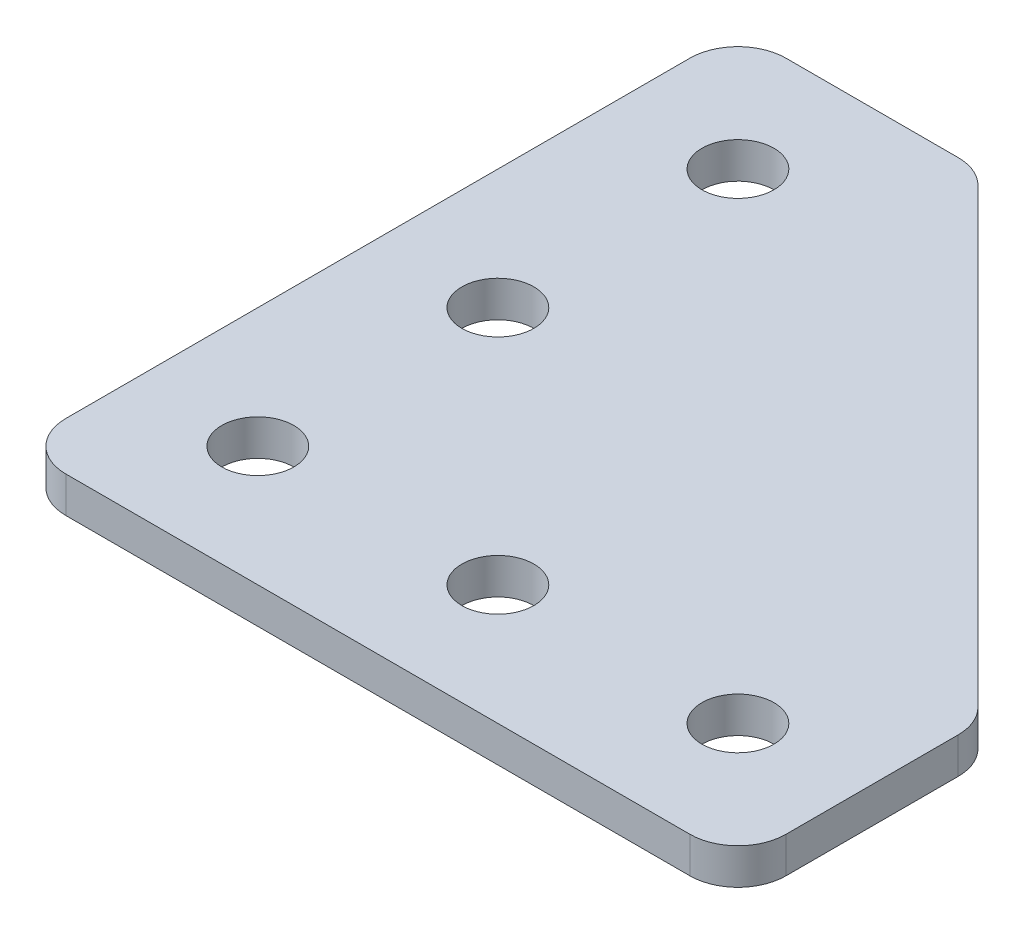
ISO-10303-21;
HEADER;
FILE_DESCRIPTION(('STEP AP214'),'2;1');
FILE_NAME('part.step','',(''),(''),'','','');
FILE_SCHEMA(('AUTOMOTIVE_DESIGN { 1 0 10303 214 1 1 1 1 }'));
ENDSEC;
DATA;
#1=APPLICATION_CONTEXT('core data for automotive mechanical design processes');
#2=APPLICATION_PROTOCOL_DEFINITION('international standard','automotive_design',2000,#1);
#3=PRODUCT_CONTEXT('',#1,'mechanical');
#4=PRODUCT('Part','Part','',(#3));
#5=PRODUCT_RELATED_PRODUCT_CATEGORY('part','',(#4));
#6=PRODUCT_DEFINITION_FORMATION('','',#4);
#7=PRODUCT_DEFINITION_CONTEXT('part definition',#1,'design');
#8=PRODUCT_DEFINITION('design','',#6,#7);
#9=PRODUCT_DEFINITION_SHAPE('','',#8);
#10=(LENGTH_UNIT() NAMED_UNIT(*) SI_UNIT(.MILLI.,.METRE.));
#11=(NAMED_UNIT(*) PLANE_ANGLE_UNIT() SI_UNIT($,.RADIAN.));
#12=(NAMED_UNIT(*) SI_UNIT($,.STERADIAN.) SOLID_ANGLE_UNIT());
#13=UNCERTAINTY_MEASURE_WITH_UNIT(LENGTH_MEASURE(1.E-05),#10,'distance_accuracy_value','');
#14=(GEOMETRIC_REPRESENTATION_CONTEXT(3) GLOBAL_UNCERTAINTY_ASSIGNED_CONTEXT((#13)) GLOBAL_UNIT_ASSIGNED_CONTEXT((#10,
#11,#12)) REPRESENTATION_CONTEXT('',''));
#15=CARTESIAN_POINT('',(0.,0.,0.));
#16=DIRECTION('',(0.,0.,1.));
#17=DIRECTION('',(1.,0.,0.));
#18=AXIS2_PLACEMENT_3D('',#15,#16,#17);
#19=CARTESIAN_POINT('',(0.,1.5,0.));
#20=DIRECTION('',(0.,1.,0.));
#21=DIRECTION('',(0.,0.,1.));
#22=AXIS2_PLACEMENT_3D('',#19,#20,#21);
#23=PLANE('',#22);
#24=CARTESIAN_POINT('',(15.,1.5,-5.));
#25=DIRECTION('',(0.,1.,0.));
#26=DIRECTION('',(0.,0.,1.));
#27=AXIS2_PLACEMENT_3D('',#24,#25,#26);
#28=CIRCLE('',#27,1.5);
#29=CARTESIAN_POINT('',(15.,1.5,-3.5));
#30=VERTEX_POINT('',#29);
#31=EDGE_CURVE('E222',#30,#30,#28,.T.);
#32=ORIENTED_EDGE('',*,*,#31,.F.);
#33=EDGE_LOOP('',(#32));
#34=FACE_BOUND('',#33,.T.);
#35=CARTESIAN_POINT('',(25.,1.5,-5.));
#36=DIRECTION('',(0.,1.,0.));
#37=DIRECTION('',(0.,0.,1.));
#38=AXIS2_PLACEMENT_3D('',#35,#36,#37);
#39=CIRCLE('',#38,1.5);
#40=CARTESIAN_POINT('',(25.,1.5,-3.5));
#41=VERTEX_POINT('',#40);
#42=EDGE_CURVE('E210',#41,#41,#39,.T.);
#43=ORIENTED_EDGE('',*,*,#42,.F.);
#44=EDGE_LOOP('',(#43));
#45=FACE_BOUND('',#44,.T.);
#46=DIRECTION('',(0.,0.,1.));
#47=VECTOR('',#46,1.);
#48=CARTESIAN_POINT('',(0.,1.5,-30.));
#49=LINE('',#48,#47);
#50=CARTESIAN_POINT('',(0.,1.5,-28.));
#51=VERTEX_POINT('',#50);
#52=CARTESIAN_POINT('',(0.,1.5,-2.00000000000001));
#53=VERTEX_POINT('',#52);
#54=EDGE_CURVE('E154',#51,#53,#49,.T.);
#55=ORIENTED_EDGE('',*,*,#54,.T.);
#56=CARTESIAN_POINT('',(2.,1.5,-2.));
#57=DIRECTION('',(0.,1.,0.));
#58=DIRECTION('',(0.,0.,1.));
#59=AXIS2_PLACEMENT_3D('',#56,#57,#58);
#60=CIRCLE('',#59,2.);
#61=CARTESIAN_POINT('',(2.,1.5,0.));
#62=VERTEX_POINT('',#61);
#63=EDGE_CURVE('E173',#53,#62,#60,.T.);
#64=ORIENTED_EDGE('',*,*,#63,.T.);
#65=DIRECTION('',(1.,0.,0.));
#66=VECTOR('',#65,1.);
#67=CARTESIAN_POINT('',(0.,1.5,0.));
#68=LINE('',#67,#66);
#69=CARTESIAN_POINT('',(28.,1.5,0.));
#70=VERTEX_POINT('',#69);
#71=EDGE_CURVE('E133',#62,#70,#68,.T.);
#72=ORIENTED_EDGE('',*,*,#71,.T.);
#73=CARTESIAN_POINT('',(28.,1.5,-2.));
#74=DIRECTION('',(0.,1.,0.));
#75=DIRECTION('',(0.,0.,1.));
#76=AXIS2_PLACEMENT_3D('',#73,#74,#75);
#77=CIRCLE('',#76,2.);
#78=CARTESIAN_POINT('',(30.,1.5,-2.));
#79=VERTEX_POINT('',#78);
#80=EDGE_CURVE('E171',#70,#79,#77,.T.);
#81=ORIENTED_EDGE('',*,*,#80,.T.);
#82=DIRECTION('',(0.,0.,-1.));
#83=VECTOR('',#82,1.);
#84=CARTESIAN_POINT('',(30.,1.5,0.));
#85=LINE('',#84,#83);
#86=CARTESIAN_POINT('',(30.,1.5,-9.17157287525381));
#87=VERTEX_POINT('',#86);
#88=EDGE_CURVE('E199',#79,#87,#85,.T.);
#89=ORIENTED_EDGE('',*,*,#88,.T.);
#90=CARTESIAN_POINT('',(28.,1.5,-9.17157287525381));
#91=DIRECTION('',(0.,1.,0.));
#92=DIRECTION('',(0.,0.,1.));
#93=AXIS2_PLACEMENT_3D('',#90,#91,#92);
#94=CIRCLE('',#93,2.);
#95=CARTESIAN_POINT('',(29.4142135623731,1.5,-10.5857864376269));
#96=VERTEX_POINT('',#95);
#97=EDGE_CURVE('E169',#87,#96,#94,.T.);
#98=ORIENTED_EDGE('',*,*,#97,.T.);
#99=DIRECTION('',(-0.707106781186548,0.,-0.707106781186548));
#100=VECTOR('',#99,1.);
#101=CARTESIAN_POINT('',(30.,1.5,-10.));
#102=LINE('',#101,#100);
#103=CARTESIAN_POINT('',(10.5857864376269,1.5,-29.4142135623731));
#104=VERTEX_POINT('',#103);
#105=EDGE_CURVE('E190',#96,#104,#102,.T.);
#106=ORIENTED_EDGE('',*,*,#105,.T.);
#107=CARTESIAN_POINT('',(9.17157287525381,1.5,-28.));
#108=DIRECTION('',(0.,1.,0.));
#109=DIRECTION('',(0.,0.,1.));
#110=AXIS2_PLACEMENT_3D('',#107,#108,#109);
#111=CIRCLE('',#110,2.);
#112=CARTESIAN_POINT('',(9.17157287525381,1.5,-30.));
#113=VERTEX_POINT('',#112);
#114=EDGE_CURVE('E56',#104,#113,#111,.T.);
#115=ORIENTED_EDGE('',*,*,#114,.T.);
#116=DIRECTION('',(-1.,0.,0.));
#117=VECTOR('',#116,1.);
#118=CARTESIAN_POINT('',(10.,1.5,-30.));
#119=LINE('',#118,#117);
#120=CARTESIAN_POINT('',(2.,1.5,-30.));
#121=VERTEX_POINT('',#120);
#122=EDGE_CURVE('E155',#113,#121,#119,.T.);
#123=ORIENTED_EDGE('',*,*,#122,.T.);
#124=CARTESIAN_POINT('',(2.,1.5,-28.));
#125=DIRECTION('',(0.,1.,0.));
#126=DIRECTION('',(0.,0.,1.));
#127=AXIS2_PLACEMENT_3D('',#124,#125,#126);
#128=CIRCLE('',#127,2.);
#129=EDGE_CURVE('E166',#121,#51,#128,.T.);
#130=ORIENTED_EDGE('',*,*,#129,.T.);
#131=EDGE_LOOP('',(#55,#64,#72,#81,#89,#98,#106,#115,#123,#130));
#132=FACE_BOUND('',#131,.T.);
#133=CARTESIAN_POINT('',(5.,1.5,-5.));
#134=DIRECTION('',(0.,1.,0.));
#135=DIRECTION('',(0.,0.,1.));
#136=AXIS2_PLACEMENT_3D('',#133,#134,#135);
#137=CIRCLE('',#136,1.5);
#138=CARTESIAN_POINT('',(5.,1.5,-3.5));
#139=VERTEX_POINT('',#138);
#140=EDGE_CURVE('E146',#139,#139,#137,.T.);
#141=ORIENTED_EDGE('',*,*,#140,.F.);
#142=EDGE_LOOP('',(#141));
#143=FACE_BOUND('',#142,.T.);
#144=CARTESIAN_POINT('',(5.,1.5,-25.));
#145=DIRECTION('',(0.,1.,0.));
#146=DIRECTION('',(0.,0.,-1.));
#147=AXIS2_PLACEMENT_3D('',#144,#145,#146);
#148=CIRCLE('',#147,1.5);
#149=CARTESIAN_POINT('',(5.,1.5,-26.5));
#150=VERTEX_POINT('',#149);
#151=EDGE_CURVE('E216',#150,#150,#148,.T.);
#152=ORIENTED_EDGE('',*,*,#151,.F.);
#153=EDGE_LOOP('',(#152));
#154=FACE_BOUND('',#153,.T.);
#155=CARTESIAN_POINT('',(5.,1.5,-15.));
#156=DIRECTION('',(0.,1.,0.));
#157=DIRECTION('',(0.,0.,1.));
#158=AXIS2_PLACEMENT_3D('',#155,#156,#157);
#159=CIRCLE('',#158,1.5);
#160=CARTESIAN_POINT('',(5.,1.5,-13.5));
#161=VERTEX_POINT('',#160);
#162=EDGE_CURVE('E228',#161,#161,#159,.T.);
#163=ORIENTED_EDGE('',*,*,#162,.F.);
#164=EDGE_LOOP('',(#163));
#165=FACE_BOUND('',#164,.T.);
#166=ADVANCED_FACE('F35',(#34,#45,#132,#143,#154,#165),#23,.T.);
#167=CARTESIAN_POINT('',(0.,0.,0.));
#168=DIRECTION('',(0.,1.,0.));
#169=DIRECTION('',(0.,0.,1.));
#170=AXIS2_PLACEMENT_3D('',#167,#168,#169);
#171=PLANE('',#170);
#172=DIRECTION('',(1.,0.,0.));
#173=VECTOR('',#172,1.);
#174=CARTESIAN_POINT('',(0.,0.,0.));
#175=LINE('',#174,#173);
#176=CARTESIAN_POINT('',(2.,0.,0.));
#177=VERTEX_POINT('',#176);
#178=CARTESIAN_POINT('',(28.,0.,0.));
#179=VERTEX_POINT('',#178);
#180=EDGE_CURVE('E130',#177,#179,#175,.T.);
#181=ORIENTED_EDGE('',*,*,#180,.F.);
#182=CARTESIAN_POINT('',(2.,0.,-2.));
#183=DIRECTION('',(0.,1.,0.));
#184=DIRECTION('',(0.,0.,1.));
#185=AXIS2_PLACEMENT_3D('',#182,#183,#184);
#186=CIRCLE('',#185,2.);
#187=CARTESIAN_POINT('',(0.,0.,-2.00000000000001));
#188=VERTEX_POINT('',#187);
#189=EDGE_CURVE('E113',#177,#188,#186,.F.);
#190=ORIENTED_EDGE('',*,*,#189,.T.);
#191=DIRECTION('',(0.,0.,1.));
#192=VECTOR('',#191,1.);
#193=CARTESIAN_POINT('',(0.,0.,-30.));
#194=LINE('',#193,#192);
#195=CARTESIAN_POINT('',(0.,0.,-28.));
#196=VERTEX_POINT('',#195);
#197=EDGE_CURVE('E141',#196,#188,#194,.T.);
#198=ORIENTED_EDGE('',*,*,#197,.F.);
#199=CARTESIAN_POINT('',(2.,0.,-28.));
#200=DIRECTION('',(0.,1.,0.));
#201=DIRECTION('',(0.,0.,1.));
#202=AXIS2_PLACEMENT_3D('',#199,#200,#201);
#203=CIRCLE('',#202,2.);
#204=CARTESIAN_POINT('',(2.,0.,-30.));
#205=VERTEX_POINT('',#204);
#206=EDGE_CURVE('E134',#196,#205,#203,.F.);
#207=ORIENTED_EDGE('',*,*,#206,.T.);
#208=DIRECTION('',(-1.,0.,0.));
#209=VECTOR('',#208,1.);
#210=CARTESIAN_POINT('',(10.,0.,-30.));
#211=LINE('',#210,#209);
#212=CARTESIAN_POINT('',(9.17157287525381,0.,-30.));
#213=VERTEX_POINT('',#212);
#214=EDGE_CURVE('E152',#213,#205,#211,.T.);
#215=ORIENTED_EDGE('',*,*,#214,.F.);
#216=CARTESIAN_POINT('',(9.17157287525381,0.,-28.));
#217=DIRECTION('',(0.,1.,0.));
#218=DIRECTION('',(0.,0.,1.));
#219=AXIS2_PLACEMENT_3D('',#216,#217,#218);
#220=CIRCLE('',#219,2.);
#221=CARTESIAN_POINT('',(10.5857864376269,0.,-29.4142135623731));
#222=VERTEX_POINT('',#221);
#223=EDGE_CURVE('E158',#213,#222,#220,.F.);
#224=ORIENTED_EDGE('',*,*,#223,.T.);
#225=DIRECTION('',(-0.707106781186548,0.,-0.707106781186548));
#226=VECTOR('',#225,1.);
#227=CARTESIAN_POINT('',(30.,0.,-10.));
#228=LINE('',#227,#226);
#229=CARTESIAN_POINT('',(29.4142135623731,0.,-10.5857864376269));
#230=VERTEX_POINT('',#229);
#231=EDGE_CURVE('E144',#230,#222,#228,.T.);
#232=ORIENTED_EDGE('',*,*,#231,.F.);
#233=CARTESIAN_POINT('',(28.,0.,-9.17157287525381));
#234=DIRECTION('',(0.,1.,0.));
#235=DIRECTION('',(0.,0.,1.));
#236=AXIS2_PLACEMENT_3D('',#233,#234,#235);
#237=CIRCLE('',#236,2.);
#238=CARTESIAN_POINT('',(30.,0.,-9.17157287525381));
#239=VERTEX_POINT('',#238);
#240=EDGE_CURVE('E160',#230,#239,#237,.F.);
#241=ORIENTED_EDGE('',*,*,#240,.T.);
#242=DIRECTION('',(0.,0.,-1.));
#243=VECTOR('',#242,1.);
#244=CARTESIAN_POINT('',(30.,0.,0.));
#245=LINE('',#244,#243);
#246=CARTESIAN_POINT('',(30.,0.,-2.));
#247=VERTEX_POINT('',#246);
#248=EDGE_CURVE('E140',#247,#239,#245,.T.);
#249=ORIENTED_EDGE('',*,*,#248,.F.);
#250=CARTESIAN_POINT('',(28.,0.,-2.));
#251=DIRECTION('',(0.,1.,0.));
#252=DIRECTION('',(0.,0.,1.));
#253=AXIS2_PLACEMENT_3D('',#250,#251,#252);
#254=CIRCLE('',#253,2.);
#255=EDGE_CURVE('E124',#247,#179,#254,.F.);
#256=ORIENTED_EDGE('',*,*,#255,.T.);
#257=EDGE_LOOP('',(#181,#190,#198,#207,#215,#224,#232,#241,#249,#256));
#258=FACE_BOUND('',#257,.T.);
#259=CARTESIAN_POINT('',(5.,0.,-5.));
#260=DIRECTION('',(0.,1.,0.));
#261=DIRECTION('',(0.,0.,1.));
#262=AXIS2_PLACEMENT_3D('',#259,#260,#261);
#263=CIRCLE('',#262,1.5);
#264=CARTESIAN_POINT('',(5.,0.,-3.5));
#265=VERTEX_POINT('',#264);
#266=EDGE_CURVE('E207',#265,#265,#263,.T.);
#267=ORIENTED_EDGE('',*,*,#266,.T.);
#268=EDGE_LOOP('',(#267));
#269=FACE_BOUND('',#268,.T.);
#270=CARTESIAN_POINT('',(25.,0.,-5.));
#271=DIRECTION('',(0.,1.,0.));
#272=DIRECTION('',(0.,0.,1.));
#273=AXIS2_PLACEMENT_3D('',#270,#271,#272);
#274=CIRCLE('',#273,1.5);
#275=CARTESIAN_POINT('',(25.,0.,-3.5));
#276=VERTEX_POINT('',#275);
#277=EDGE_CURVE('E213',#276,#276,#274,.T.);
#278=ORIENTED_EDGE('',*,*,#277,.T.);
#279=EDGE_LOOP('',(#278));
#280=FACE_BOUND('',#279,.T.);
#281=CARTESIAN_POINT('',(5.,0.,-25.));
#282=DIRECTION('',(0.,1.,0.));
#283=DIRECTION('',(0.,0.,-1.));
#284=AXIS2_PLACEMENT_3D('',#281,#282,#283);
#285=CIRCLE('',#284,1.5);
#286=CARTESIAN_POINT('',(5.,0.,-26.5));
#287=VERTEX_POINT('',#286);
#288=EDGE_CURVE('E219',#287,#287,#285,.T.);
#289=ORIENTED_EDGE('',*,*,#288,.T.);
#290=EDGE_LOOP('',(#289));
#291=FACE_BOUND('',#290,.T.);
#292=CARTESIAN_POINT('',(15.,0.,-5.));
#293=DIRECTION('',(0.,1.,0.));
#294=DIRECTION('',(0.,0.,1.));
#295=AXIS2_PLACEMENT_3D('',#292,#293,#294);
#296=CIRCLE('',#295,1.5);
#297=CARTESIAN_POINT('',(15.,0.,-3.5));
#298=VERTEX_POINT('',#297);
#299=EDGE_CURVE('E225',#298,#298,#296,.T.);
#300=ORIENTED_EDGE('',*,*,#299,.T.);
#301=EDGE_LOOP('',(#300));
#302=FACE_BOUND('',#301,.T.);
#303=CARTESIAN_POINT('',(5.,0.,-15.));
#304=DIRECTION('',(0.,1.,0.));
#305=DIRECTION('',(0.,0.,1.));
#306=AXIS2_PLACEMENT_3D('',#303,#304,#305);
#307=CIRCLE('',#306,1.5);
#308=CARTESIAN_POINT('',(5.,0.,-13.5));
#309=VERTEX_POINT('',#308);
#310=EDGE_CURVE('E231',#309,#309,#307,.T.);
#311=ORIENTED_EDGE('',*,*,#310,.T.);
#312=EDGE_LOOP('',(#311));
#313=FACE_BOUND('',#312,.T.);
#314=ADVANCED_FACE('F137',(#258,#269,#280,#291,#302,#313),#171,.F.);
#315=CARTESIAN_POINT('',(0.,1.5,-30.));
#316=DIRECTION('',(1.,0.,0.));
#317=DIRECTION('',(0.,0.,-1.));
#318=AXIS2_PLACEMENT_3D('',#315,#316,#317);
#319=PLANE('',#318);
#320=ORIENTED_EDGE('',*,*,#197,.T.);
#321=DIRECTION('',(0.,-1.,0.));
#322=VECTOR('',#321,1.);
#323=CARTESIAN_POINT('',(0.,1.5,-2.));
#324=LINE('',#323,#322);
#325=EDGE_CURVE('E118',#188,#53,#324,.F.);
#326=ORIENTED_EDGE('',*,*,#325,.T.);
#327=ORIENTED_EDGE('',*,*,#54,.F.);
#328=DIRECTION('',(0.,-1.,0.));
#329=VECTOR('',#328,1.);
#330=CARTESIAN_POINT('',(0.,1.5,-28.));
#331=LINE('',#330,#329);
#332=EDGE_CURVE('E123',#51,#196,#331,.T.);
#333=ORIENTED_EDGE('',*,*,#332,.T.);
#334=EDGE_LOOP('',(#320,#326,#327,#333));
#335=FACE_BOUND('',#334,.T.);
#336=ADVANCED_FACE('F246',(#335),#319,.F.);
#337=CARTESIAN_POINT('',(0.,1.5,0.));
#338=DIRECTION('',(0.,0.,-1.));
#339=DIRECTION('',(-1.,0.,0.));
#340=AXIS2_PLACEMENT_3D('',#337,#338,#339);
#341=PLANE('',#340);
#342=ORIENTED_EDGE('',*,*,#71,.F.);
#343=DIRECTION('',(0.,-1.,0.));
#344=VECTOR('',#343,1.);
#345=CARTESIAN_POINT('',(2.,1.5,0.));
#346=LINE('',#345,#344);
#347=EDGE_CURVE('E117',#62,#177,#346,.T.);
#348=ORIENTED_EDGE('',*,*,#347,.T.);
#349=ORIENTED_EDGE('',*,*,#180,.T.);
#350=DIRECTION('',(0.,-1.,0.));
#351=VECTOR('',#350,1.);
#352=CARTESIAN_POINT('',(28.,1.5,0.));
#353=LINE('',#352,#351);
#354=EDGE_CURVE('E135',#179,#70,#353,.F.);
#355=ORIENTED_EDGE('',*,*,#354,.T.);
#356=EDGE_LOOP('',(#342,#348,#349,#355));
#357=FACE_BOUND('',#356,.T.);
#358=ADVANCED_FACE('F129',(#357),#341,.F.);
#359=CARTESIAN_POINT('',(30.,1.5,0.));
#360=DIRECTION('',(-1.,0.,0.));
#361=DIRECTION('',(0.,0.,1.));
#362=AXIS2_PLACEMENT_3D('',#359,#360,#361);
#363=PLANE('',#362);
#364=ORIENTED_EDGE('',*,*,#88,.F.);
#365=DIRECTION('',(0.,-1.,0.));
#366=VECTOR('',#365,1.);
#367=CARTESIAN_POINT('',(30.,1.5,-2.));
#368=LINE('',#367,#366);
#369=EDGE_CURVE('E177',#79,#247,#368,.T.);
#370=ORIENTED_EDGE('',*,*,#369,.T.);
#371=ORIENTED_EDGE('',*,*,#248,.T.);
#372=DIRECTION('',(0.,-1.,0.));
#373=VECTOR('',#372,1.);
#374=CARTESIAN_POINT('',(30.,1.5,-9.17157287525381));
#375=LINE('',#374,#373);
#376=EDGE_CURVE('E175',#239,#87,#375,.F.);
#377=ORIENTED_EDGE('',*,*,#376,.T.);
#378=EDGE_LOOP('',(#364,#370,#371,#377));
#379=FACE_BOUND('',#378,.T.);
#380=ADVANCED_FACE('F258',(#379),#363,.F.);
#381=CARTESIAN_POINT('',(30.,1.5,-10.));
#382=DIRECTION('',(-0.707106781186547,0.,0.707106781186547));
#383=DIRECTION('',(0.707106781186548,0.,0.707106781186548));
#384=AXIS2_PLACEMENT_3D('',#381,#382,#383);
#385=PLANE('',#384);
#386=ORIENTED_EDGE('',*,*,#105,.F.);
#387=DIRECTION('',(0.,-1.,0.));
#388=VECTOR('',#387,1.);
#389=CARTESIAN_POINT('',(29.4142135623731,1.5,-10.5857864376269));
#390=LINE('',#389,#388);
#391=EDGE_CURVE('E182',#96,#230,#390,.T.);
#392=ORIENTED_EDGE('',*,*,#391,.T.);
#393=ORIENTED_EDGE('',*,*,#231,.T.);
#394=DIRECTION('',(0.,-1.,0.));
#395=VECTOR('',#394,1.);
#396=CARTESIAN_POINT('',(10.5857864376269,1.5,-29.4142135623731));
#397=LINE('',#396,#395);
#398=EDGE_CURVE('E180',#222,#104,#397,.F.);
#399=ORIENTED_EDGE('',*,*,#398,.T.);
#400=EDGE_LOOP('',(#386,#392,#393,#399));
#401=FACE_BOUND('',#400,.T.);
#402=ADVANCED_FACE('F188',(#401),#385,.F.);
#403=CARTESIAN_POINT('',(10.,1.5,-30.));
#404=DIRECTION('',(0.,0.,1.));
#405=DIRECTION('',(1.,0.,0.));
#406=AXIS2_PLACEMENT_3D('',#403,#404,#405);
#407=PLANE('',#406);
#408=ORIENTED_EDGE('',*,*,#122,.F.);
#409=DIRECTION('',(0.,-1.,0.));
#410=VECTOR('',#409,1.);
#411=CARTESIAN_POINT('',(9.17157287525381,1.5,-30.));
#412=LINE('',#411,#410);
#413=EDGE_CURVE('E11',#113,#213,#412,.T.);
#414=ORIENTED_EDGE('',*,*,#413,.T.);
#415=ORIENTED_EDGE('',*,*,#214,.T.);
#416=DIRECTION('',(0.,-1.,0.));
#417=VECTOR('',#416,1.);
#418=CARTESIAN_POINT('',(2.,1.5,-30.));
#419=LINE('',#418,#417);
#420=EDGE_CURVE('E43',#205,#121,#419,.F.);
#421=ORIENTED_EDGE('',*,*,#420,.T.);
#422=EDGE_LOOP('',(#408,#414,#415,#421));
#423=FACE_BOUND('',#422,.T.);
#424=ADVANCED_FACE('F197',(#423),#407,.F.);
#425=CARTESIAN_POINT('',(5.,1.5,-5.));
#426=DIRECTION('',(0.,-1.,0.));
#427=DIRECTION('',(0.,0.,-1.));
#428=AXIS2_PLACEMENT_3D('',#425,#426,#427);
#429=CYLINDRICAL_SURFACE('',#428,1.5);
#430=ORIENTED_EDGE('',*,*,#140,.T.);
#431=EDGE_LOOP('',(#430));
#432=FACE_BOUND('',#431,.T.);
#433=ORIENTED_EDGE('',*,*,#266,.F.);
#434=EDGE_LOOP('',(#433));
#435=FACE_BOUND('',#434,.T.);
#436=ADVANCED_FACE('F251',(#432,#435),#429,.F.);
#437=CARTESIAN_POINT('',(25.,1.5,-5.));
#438=DIRECTION('',(0.,-1.,0.));
#439=DIRECTION('',(0.,0.,-1.));
#440=AXIS2_PLACEMENT_3D('',#437,#438,#439);
#441=CYLINDRICAL_SURFACE('',#440,1.5);
#442=ORIENTED_EDGE('',*,*,#42,.T.);
#443=EDGE_LOOP('',(#442));
#444=FACE_BOUND('',#443,.T.);
#445=ORIENTED_EDGE('',*,*,#277,.F.);
#446=EDGE_LOOP('',(#445));
#447=FACE_BOUND('',#446,.T.);
#448=ADVANCED_FACE('F297',(#444,#447),#441,.F.);
#449=CARTESIAN_POINT('',(5.,1.5,-25.));
#450=DIRECTION('',(0.,-1.,0.));
#451=DIRECTION('',(0.,0.,-1.));
#452=AXIS2_PLACEMENT_3D('',#449,#450,#451);
#453=CYLINDRICAL_SURFACE('',#452,1.5);
#454=ORIENTED_EDGE('',*,*,#151,.T.);
#455=EDGE_LOOP('',(#454));
#456=FACE_BOUND('',#455,.T.);
#457=ORIENTED_EDGE('',*,*,#288,.F.);
#458=EDGE_LOOP('',(#457));
#459=FACE_BOUND('',#458,.T.);
#460=ADVANCED_FACE('F293',(#456,#459),#453,.F.);
#461=CARTESIAN_POINT('',(15.,1.5,-5.));
#462=DIRECTION('',(0.,-1.,0.));
#463=DIRECTION('',(0.,0.,-1.));
#464=AXIS2_PLACEMENT_3D('',#461,#462,#463);
#465=CYLINDRICAL_SURFACE('',#464,1.5);
#466=ORIENTED_EDGE('',*,*,#31,.T.);
#467=EDGE_LOOP('',(#466));
#468=FACE_BOUND('',#467,.T.);
#469=ORIENTED_EDGE('',*,*,#299,.F.);
#470=EDGE_LOOP('',(#469));
#471=FACE_BOUND('',#470,.T.);
#472=ADVANCED_FACE('F296',(#468,#471),#465,.F.);
#473=CARTESIAN_POINT('',(5.,1.5,-15.));
#474=DIRECTION('',(0.,-1.,0.));
#475=DIRECTION('',(0.,0.,-1.));
#476=AXIS2_PLACEMENT_3D('',#473,#474,#475);
#477=CYLINDRICAL_SURFACE('',#476,1.5);
#478=ORIENTED_EDGE('',*,*,#162,.T.);
#479=EDGE_LOOP('',(#478));
#480=FACE_BOUND('',#479,.T.);
#481=ORIENTED_EDGE('',*,*,#310,.F.);
#482=EDGE_LOOP('',(#481));
#483=FACE_BOUND('',#482,.T.);
#484=ADVANCED_FACE('F237',(#480,#483),#477,.F.);
#485=CARTESIAN_POINT('',(2.,1.5,-2.));
#486=DIRECTION('',(0.,-1.,0.));
#487=DIRECTION('',(0.,0.,-1.));
#488=AXIS2_PLACEMENT_3D('',#485,#486,#487);
#489=CYLINDRICAL_SURFACE('',#488,2.);
#490=ORIENTED_EDGE('',*,*,#63,.F.);
#491=ORIENTED_EDGE('',*,*,#325,.F.);
#492=ORIENTED_EDGE('',*,*,#189,.F.);
#493=ORIENTED_EDGE('',*,*,#347,.F.);
#494=EDGE_LOOP('',(#490,#491,#492,#493));
#495=FACE_BOUND('',#494,.T.);
#496=ADVANCED_FACE('F116',(#495),#489,.T.);
#497=CARTESIAN_POINT('',(28.,1.5,-2.));
#498=DIRECTION('',(0.,-1.,0.));
#499=DIRECTION('',(0.,0.,-1.));
#500=AXIS2_PLACEMENT_3D('',#497,#498,#499);
#501=CYLINDRICAL_SURFACE('',#500,2.);
#502=ORIENTED_EDGE('',*,*,#80,.F.);
#503=ORIENTED_EDGE('',*,*,#354,.F.);
#504=ORIENTED_EDGE('',*,*,#255,.F.);
#505=ORIENTED_EDGE('',*,*,#369,.F.);
#506=EDGE_LOOP('',(#502,#503,#504,#505));
#507=FACE_BOUND('',#506,.T.);
#508=ADVANCED_FACE('F269',(#507),#501,.T.);
#509=CARTESIAN_POINT('',(28.,1.5,-9.17157287525381));
#510=DIRECTION('',(0.,-1.,0.));
#511=DIRECTION('',(0.,0.,-1.));
#512=AXIS2_PLACEMENT_3D('',#509,#510,#511);
#513=CYLINDRICAL_SURFACE('',#512,2.);
#514=ORIENTED_EDGE('',*,*,#97,.F.);
#515=ORIENTED_EDGE('',*,*,#376,.F.);
#516=ORIENTED_EDGE('',*,*,#240,.F.);
#517=ORIENTED_EDGE('',*,*,#391,.F.);
#518=EDGE_LOOP('',(#514,#515,#516,#517));
#519=FACE_BOUND('',#518,.T.);
#520=ADVANCED_FACE('F272',(#519),#513,.T.);
#521=CARTESIAN_POINT('',(9.17157287525381,1.5,-28.));
#522=DIRECTION('',(0.,-1.,0.));
#523=DIRECTION('',(0.,0.,-1.));
#524=AXIS2_PLACEMENT_3D('',#521,#522,#523);
#525=CYLINDRICAL_SURFACE('',#524,2.);
#526=ORIENTED_EDGE('',*,*,#114,.F.);
#527=ORIENTED_EDGE('',*,*,#398,.F.);
#528=ORIENTED_EDGE('',*,*,#223,.F.);
#529=ORIENTED_EDGE('',*,*,#413,.F.);
#530=EDGE_LOOP('',(#526,#527,#528,#529));
#531=FACE_BOUND('',#530,.T.);
#532=ADVANCED_FACE('F196',(#531),#525,.T.);
#533=CARTESIAN_POINT('',(2.,1.5,-28.));
#534=DIRECTION('',(0.,-1.,0.));
#535=DIRECTION('',(0.,0.,-1.));
#536=AXIS2_PLACEMENT_3D('',#533,#534,#535);
#537=CYLINDRICAL_SURFACE('',#536,2.);
#538=ORIENTED_EDGE('',*,*,#129,.F.);
#539=ORIENTED_EDGE('',*,*,#420,.F.);
#540=ORIENTED_EDGE('',*,*,#206,.F.);
#541=ORIENTED_EDGE('',*,*,#332,.F.);
#542=EDGE_LOOP('',(#538,#539,#540,#541));
#543=FACE_BOUND('',#542,.T.);
#544=ADVANCED_FACE('F37',(#543),#537,.T.);
#545=CLOSED_SHELL('',(#166,#314,#336,#358,#380,#402,#424,#436,#448,#460,#472,#484,#496,#508,
#520,#532,#544));
#546=MANIFOLD_SOLID_BREP('B2',#545);
#547=ADVANCED_BREP_SHAPE_REPRESENTATION('',(#18,#546),#14);
#548=SHAPE_DEFINITION_REPRESENTATION(#9,#547);
ENDSEC;
END-ISO-10303-21;
